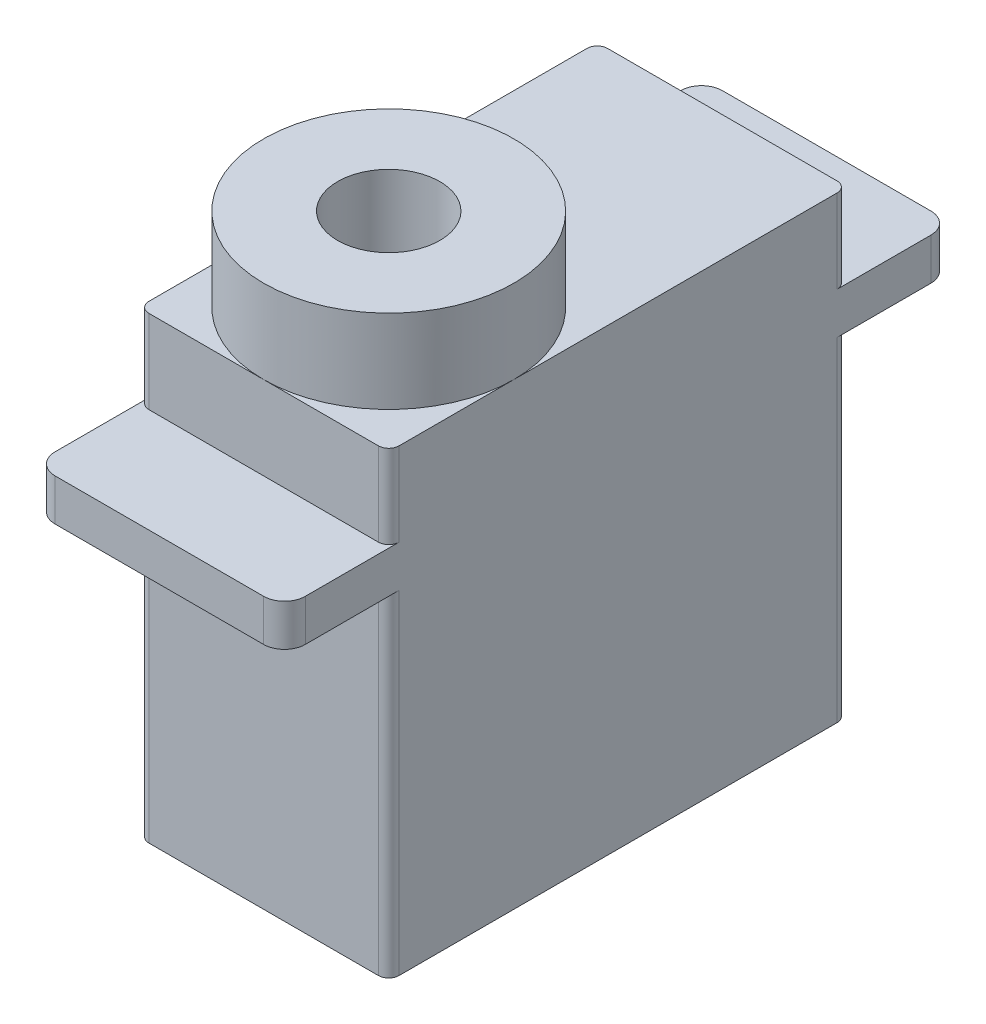
ISO-10303-21;
HEADER;
FILE_DESCRIPTION(('STEP AP214'),'2;1');
FILE_NAME('part.step','',(''),(''),'','','');
FILE_SCHEMA(('AUTOMOTIVE_DESIGN { 1 0 10303 214 1 1 1 1 }'));
ENDSEC;
DATA;
#1=APPLICATION_CONTEXT('core data for automotive mechanical design processes');
#2=APPLICATION_PROTOCOL_DEFINITION('international standard','automotive_design',2000,#1);
#3=PRODUCT_CONTEXT('',#1,'mechanical');
#4=PRODUCT('Part','Part','',(#3));
#5=PRODUCT_RELATED_PRODUCT_CATEGORY('part','',(#4));
#6=PRODUCT_DEFINITION_FORMATION('','',#4);
#7=PRODUCT_DEFINITION_CONTEXT('part definition',#1,'design');
#8=PRODUCT_DEFINITION('design','',#6,#7);
#9=PRODUCT_DEFINITION_SHAPE('','',#8);
#10=(LENGTH_UNIT() NAMED_UNIT(*) SI_UNIT(.MILLI.,.METRE.));
#11=(NAMED_UNIT(*) PLANE_ANGLE_UNIT() SI_UNIT($,.RADIAN.));
#12=(NAMED_UNIT(*) SI_UNIT($,.STERADIAN.) SOLID_ANGLE_UNIT());
#13=UNCERTAINTY_MEASURE_WITH_UNIT(LENGTH_MEASURE(1.E-05),#10,'distance_accuracy_value','');
#14=(GEOMETRIC_REPRESENTATION_CONTEXT(3) GLOBAL_UNCERTAINTY_ASSIGNED_CONTEXT((#13)) GLOBAL_UNIT_ASSIGNED_CONTEXT((#10,
#11,#12)) REPRESENTATION_CONTEXT('',''));
#15=CARTESIAN_POINT('',(0.,0.,0.));
#16=DIRECTION('',(0.,0.,1.));
#17=DIRECTION('',(1.,0.,0.));
#18=AXIS2_PLACEMENT_3D('',#15,#16,#17);
#19=CARTESIAN_POINT('',(0.,22.,31.7209302325581));
#20=DIRECTION('',(0.,0.,1.));
#21=DIRECTION('',(1.,0.,0.));
#22=AXIS2_PLACEMENT_3D('',#19,#20,#21);
#23=PLANE('',#22);
#24=DIRECTION('',(1.,0.,0.));
#25=VECTOR('',#24,1.);
#26=CARTESIAN_POINT('',(12.,18.,31.7209302325581));
#27=LINE('',#26,#25);
#28=CARTESIAN_POINT('',(0.5,18.,31.7209302325581));
#29=VERTEX_POINT('',#28);
#30=CARTESIAN_POINT('',(11.5,18.,31.7209302325581));
#31=VERTEX_POINT('',#30);
#32=EDGE_CURVE('E521',#29,#31,#27,.T.);
#33=ORIENTED_EDGE('',*,*,#32,.F.);
#34=DIRECTION('',(0.,-1.,0.));
#35=VECTOR('',#34,1.);
#36=CARTESIAN_POINT('',(0.5,22.,31.7209302325581));
#37=LINE('',#36,#35);
#38=CARTESIAN_POINT('',(0.5,22.,31.7209302325581));
#39=VERTEX_POINT('',#38);
#40=EDGE_CURVE('E327',#29,#39,#37,.F.);
#41=ORIENTED_EDGE('',*,*,#40,.T.);
#42=DIRECTION('',(-1.,0.,0.));
#43=VECTOR('',#42,1.);
#44=CARTESIAN_POINT('',(0.,22.,31.7209302325581));
#45=LINE('',#44,#43);
#46=CARTESIAN_POINT('',(11.5,22.,31.7209302325581));
#47=VERTEX_POINT('',#46);
#48=EDGE_CURVE('E240',#47,#39,#45,.T.);
#49=ORIENTED_EDGE('',*,*,#48,.F.);
#50=DIRECTION('',(0.,-1.,0.));
#51=VECTOR('',#50,1.);
#52=CARTESIAN_POINT('',(11.5,22.,31.7209302325581));
#53=LINE('',#52,#51);
#54=EDGE_CURVE('E324',#47,#31,#53,.T.);
#55=ORIENTED_EDGE('',*,*,#54,.T.);
#56=EDGE_LOOP('',(#33,#41,#49,#55));
#57=FACE_BOUND('',#56,.T.);
#58=ADVANCED_FACE('F33',(#57),#23,.F.);
#59=DIRECTION('',(-1.,0.,0.));
#60=VECTOR('',#59,1.);
#61=CARTESIAN_POINT('',(12.,16.,31.7209302325581));
#62=LINE('',#61,#60);
#63=CARTESIAN_POINT('',(11.5,16.,31.7209302325581));
#64=VERTEX_POINT('',#63);
#65=CARTESIAN_POINT('',(0.5,16.,31.7209302325581));
#66=VERTEX_POINT('',#65);
#67=EDGE_CURVE('E373',#64,#66,#62,.T.);
#68=ORIENTED_EDGE('',*,*,#67,.F.);
#69=DIRECTION('',(0.,-1.,0.));
#70=VECTOR('',#69,1.);
#71=CARTESIAN_POINT('',(11.5,22.,31.7209302325581));
#72=LINE('',#71,#70);
#73=CARTESIAN_POINT('',(11.5,0.,31.7209302325581));
#74=VERTEX_POINT('',#73);
#75=EDGE_CURVE('E335',#64,#74,#72,.T.);
#76=ORIENTED_EDGE('',*,*,#75,.T.);
#77=DIRECTION('',(-1.,0.,0.));
#78=VECTOR('',#77,1.);
#79=CARTESIAN_POINT('',(0.,0.,31.7209302325581));
#80=LINE('',#79,#78);
#81=CARTESIAN_POINT('',(0.5,0.,31.7209302325581));
#82=VERTEX_POINT('',#81);
#83=EDGE_CURVE('E258',#74,#82,#80,.T.);
#84=ORIENTED_EDGE('',*,*,#83,.T.);
#85=DIRECTION('',(0.,-1.,0.));
#86=VECTOR('',#85,1.);
#87=CARTESIAN_POINT('',(0.5,22.,31.7209302325581));
#88=LINE('',#87,#86);
#89=EDGE_CURVE('E333',#82,#66,#88,.F.);
#90=ORIENTED_EDGE('',*,*,#89,.T.);
#91=EDGE_LOOP('',(#68,#76,#84,#90));
#92=FACE_BOUND('',#91,.T.);
#93=ADVANCED_FACE('F434',(#92),#23,.F.);
#94=CARTESIAN_POINT('',(0.,22.,53.7209302325581));
#95=DIRECTION('',(0.,0.,-1.));
#96=DIRECTION('',(-1.,0.,0.));
#97=AXIS2_PLACEMENT_3D('',#94,#95,#96);
#98=PLANE('',#97);
#99=DIRECTION('',(1.,0.,0.));
#100=VECTOR('',#99,1.);
#101=CARTESIAN_POINT('',(0.,16.,53.7209302325581));
#102=LINE('',#101,#100);
#103=CARTESIAN_POINT('',(0.5,16.,53.7209302325581));
#104=VERTEX_POINT('',#103);
#105=CARTESIAN_POINT('',(11.5,16.,53.7209302325581));
#106=VERTEX_POINT('',#105);
#107=EDGE_CURVE('E389',#104,#106,#102,.T.);
#108=ORIENTED_EDGE('',*,*,#107,.F.);
#109=DIRECTION('',(0.,-1.,0.));
#110=VECTOR('',#109,1.);
#111=CARTESIAN_POINT('',(0.5,22.,53.7209302325581));
#112=LINE('',#111,#110);
#113=CARTESIAN_POINT('',(0.5,0.,53.7209302325581));
#114=VERTEX_POINT('',#113);
#115=EDGE_CURVE('E347',#104,#114,#112,.T.);
#116=ORIENTED_EDGE('',*,*,#115,.T.);
#117=DIRECTION('',(1.,0.,0.));
#118=VECTOR('',#117,1.);
#119=CARTESIAN_POINT('',(0.,0.,53.7209302325581));
#120=LINE('',#119,#118);
#121=CARTESIAN_POINT('',(11.5,0.,53.7209302325581));
#122=VERTEX_POINT('',#121);
#123=EDGE_CURVE('E253',#114,#122,#120,.T.);
#124=ORIENTED_EDGE('',*,*,#123,.T.);
#125=DIRECTION('',(0.,-1.,0.));
#126=VECTOR('',#125,1.);
#127=CARTESIAN_POINT('',(11.5,22.,53.7209302325581));
#128=LINE('',#127,#126);
#129=EDGE_CURVE('E48',#122,#106,#128,.F.);
#130=ORIENTED_EDGE('',*,*,#129,.T.);
#131=EDGE_LOOP('',(#108,#116,#124,#130));
#132=FACE_BOUND('',#131,.T.);
#133=ADVANCED_FACE('F388',(#132),#98,.F.);
#134=DIRECTION('',(-1.,0.,0.));
#135=VECTOR('',#134,1.);
#136=CARTESIAN_POINT('',(0.,18.,53.7209302325581));
#137=LINE('',#136,#135);
#138=CARTESIAN_POINT('',(11.5,18.,53.7209302325581));
#139=VERTEX_POINT('',#138);
#140=CARTESIAN_POINT('',(0.5,18.,53.7209302325581));
#141=VERTEX_POINT('',#140);
#142=EDGE_CURVE('E391',#139,#141,#137,.T.);
#143=ORIENTED_EDGE('',*,*,#142,.F.);
#144=DIRECTION('',(0.,-1.,0.));
#145=VECTOR('',#144,1.);
#146=CARTESIAN_POINT('',(11.5,22.,53.7209302325581));
#147=LINE('',#146,#145);
#148=CARTESIAN_POINT('',(11.5,22.,53.7209302325581));
#149=VERTEX_POINT('',#148);
#150=EDGE_CURVE('E223',#139,#149,#147,.F.);
#151=ORIENTED_EDGE('',*,*,#150,.T.);
#152=DIRECTION('',(1.,0.,0.));
#153=VECTOR('',#152,1.);
#154=CARTESIAN_POINT('',(0.,22.,53.7209302325581));
#155=LINE('',#154,#153);
#156=CARTESIAN_POINT('',(6.,22.,53.7209302325581));
#157=VERTEX_POINT('',#156);
#158=EDGE_CURVE('E216',#157,#149,#155,.T.);
#159=ORIENTED_EDGE('',*,*,#158,.F.);
#160=CARTESIAN_POINT('',(0.5,22.,53.7209302325581));
#161=VERTEX_POINT('',#160);
#162=EDGE_CURVE('E203',#161,#157,#155,.T.);
#163=ORIENTED_EDGE('',*,*,#162,.F.);
#164=DIRECTION('',(0.,-1.,0.));
#165=VECTOR('',#164,1.);
#166=CARTESIAN_POINT('',(0.5,22.,53.7209302325581));
#167=LINE('',#166,#165);
#168=EDGE_CURVE('E307',#161,#141,#167,.T.);
#169=ORIENTED_EDGE('',*,*,#168,.T.);
#170=EDGE_LOOP('',(#143,#151,#159,#163,#169));
#171=FACE_BOUND('',#170,.T.);
#172=ADVANCED_FACE('F221',(#171),#98,.F.);
#173=CARTESIAN_POINT('',(0.,22.,0.));
#174=DIRECTION('',(0.,1.,0.));
#175=DIRECTION('',(0.,0.,1.));
#176=AXIS2_PLACEMENT_3D('',#173,#174,#175);
#177=PLANE('',#176);
#178=ORIENTED_EDGE('',*,*,#158,.T.);
#179=CARTESIAN_POINT('',(11.5,22.,53.2209302325581));
#180=DIRECTION('',(0.,1.,0.));
#181=DIRECTION('',(0.,0.,1.));
#182=AXIS2_PLACEMENT_3D('',#179,#180,#181);
#183=CIRCLE('',#182,0.5);
#184=CARTESIAN_POINT('',(12.,22.,53.2209302325581));
#185=VERTEX_POINT('',#184);
#186=EDGE_CURVE('E310',#149,#185,#183,.T.);
#187=ORIENTED_EDGE('',*,*,#186,.T.);
#188=DIRECTION('',(0.,0.,-1.));
#189=VECTOR('',#188,1.);
#190=CARTESIAN_POINT('',(12.,22.,31.7209302325581));
#191=LINE('',#190,#189);
#192=CARTESIAN_POINT('',(12.,22.,47.7209302325581));
#193=VERTEX_POINT('',#192);
#194=EDGE_CURVE('E231',#185,#193,#191,.T.);
#195=ORIENTED_EDGE('',*,*,#194,.T.);
#196=CARTESIAN_POINT('',(6.,22.,47.7209302325581));
#197=DIRECTION('',(0.,1.,0.));
#198=DIRECTION('',(0.,0.,1.));
#199=AXIS2_PLACEMENT_3D('',#196,#197,#198);
#200=CIRCLE('',#199,6.);
#201=EDGE_CURVE('E228',#157,#193,#200,.T.);
#202=ORIENTED_EDGE('',*,*,#201,.F.);
#203=EDGE_LOOP('',(#178,#187,#195,#202));
#204=FACE_BOUND('',#203,.T.);
#205=ADVANCED_FACE('F229',(#204),#177,.T.);
#206=ORIENTED_EDGE('',*,*,#48,.T.);
#207=CARTESIAN_POINT('',(0.5,22.,32.2209302325581));
#208=DIRECTION('',(0.,1.,0.));
#209=DIRECTION('',(0.,0.,1.));
#210=AXIS2_PLACEMENT_3D('',#207,#208,#209);
#211=CIRCLE('',#210,0.5);
#212=CARTESIAN_POINT('',(0.,22.,32.2209302325581));
#213=VERTEX_POINT('',#212);
#214=EDGE_CURVE('E331',#39,#213,#211,.T.);
#215=ORIENTED_EDGE('',*,*,#214,.T.);
#216=DIRECTION('',(0.,0.,1.));
#217=VECTOR('',#216,1.);
#218=CARTESIAN_POINT('',(0.,22.,31.7209302325581));
#219=LINE('',#218,#217);
#220=CARTESIAN_POINT('',(0.,22.,47.7209302325581));
#221=VERTEX_POINT('',#220);
#222=EDGE_CURVE('E226',#213,#221,#219,.T.);
#223=ORIENTED_EDGE('',*,*,#222,.T.);
#224=EDGE_CURVE('E238',#193,#221,#200,.T.);
#225=ORIENTED_EDGE('',*,*,#224,.F.);
#226=CARTESIAN_POINT('',(12.,22.,32.2209302325581));
#227=VERTEX_POINT('',#226);
#228=EDGE_CURVE('E215',#193,#227,#191,.T.);
#229=ORIENTED_EDGE('',*,*,#228,.T.);
#230=CARTESIAN_POINT('',(11.5,22.,32.2209302325581));
#231=DIRECTION('',(0.,1.,0.));
#232=DIRECTION('',(0.,0.,1.));
#233=AXIS2_PLACEMENT_3D('',#230,#231,#232);
#234=CIRCLE('',#233,0.5);
#235=EDGE_CURVE('E329',#227,#47,#234,.T.);
#236=ORIENTED_EDGE('',*,*,#235,.T.);
#237=EDGE_LOOP('',(#206,#215,#223,#225,#229,#236));
#238=FACE_BOUND('',#237,.T.);
#239=ADVANCED_FACE('F427',(#238),#177,.T.);
#240=CARTESIAN_POINT('',(0.,22.,31.7209302325581));
#241=DIRECTION('',(1.,0.,0.));
#242=DIRECTION('',(0.,0.,-1.));
#243=AXIS2_PLACEMENT_3D('',#240,#241,#242);
#244=PLANE('',#243);
#245=DIRECTION('',(0.,0.,-1.));
#246=VECTOR('',#245,1.);
#247=CARTESIAN_POINT('',(0.,18.,58.7209302325581));
#248=LINE('',#247,#246);
#249=CARTESIAN_POINT('',(0.,18.,57.7209302325581));
#250=VERTEX_POINT('',#249);
#251=CARTESIAN_POINT('',(0.,18.,53.2209302325581));
#252=VERTEX_POINT('',#251);
#253=EDGE_CURVE('E402',#250,#252,#248,.T.);
#254=ORIENTED_EDGE('',*,*,#253,.T.);
#255=DIRECTION('',(0.,-1.,0.));
#256=VECTOR('',#255,1.);
#257=CARTESIAN_POINT('',(0.,22.,53.2209302325581));
#258=LINE('',#257,#256);
#259=CARTESIAN_POINT('',(0.,22.,53.2209302325581));
#260=VERTEX_POINT('',#259);
#261=EDGE_CURVE('E321',#252,#260,#258,.F.);
#262=ORIENTED_EDGE('',*,*,#261,.T.);
#263=EDGE_CURVE('E247',#221,#260,#219,.T.);
#264=ORIENTED_EDGE('',*,*,#263,.F.);
#265=ORIENTED_EDGE('',*,*,#222,.F.);
#266=DIRECTION('',(0.,-1.,0.));
#267=VECTOR('',#266,1.);
#268=CARTESIAN_POINT('',(0.,22.,32.2209302325581));
#269=LINE('',#268,#267);
#270=CARTESIAN_POINT('',(0.,18.,32.2209302325581));
#271=VERTEX_POINT('',#270);
#272=EDGE_CURVE('E318',#213,#271,#269,.T.);
#273=ORIENTED_EDGE('',*,*,#272,.T.);
#274=DIRECTION('',(0.,0.,1.));
#275=VECTOR('',#274,1.);
#276=CARTESIAN_POINT('',(0.,18.,26.7209302325581));
#277=LINE('',#276,#275);
#278=CARTESIAN_POINT('',(0.,18.,27.7209302325581));
#279=VERTEX_POINT('',#278);
#280=EDGE_CURVE('E516',#279,#271,#277,.T.);
#281=ORIENTED_EDGE('',*,*,#280,.F.);
#282=DIRECTION('',(0.,1.,0.));
#283=VECTOR('',#282,1.);
#284=CARTESIAN_POINT('',(0.,16.,27.7209302325581));
#285=LINE('',#284,#283);
#286=CARTESIAN_POINT('',(0.,16.,27.7209302325581));
#287=VERTEX_POINT('',#286);
#288=EDGE_CURVE('E272',#279,#287,#285,.F.);
#289=ORIENTED_EDGE('',*,*,#288,.T.);
#290=DIRECTION('',(0.,0.,1.));
#291=VECTOR('',#290,1.);
#292=CARTESIAN_POINT('',(0.,16.,26.7209302325581));
#293=LINE('',#292,#291);
#294=CARTESIAN_POINT('',(0.,16.,32.2209302325581));
#295=VERTEX_POINT('',#294);
#296=EDGE_CURVE('E370',#287,#295,#293,.T.);
#297=ORIENTED_EDGE('',*,*,#296,.T.);
#298=DIRECTION('',(0.,-1.,0.));
#299=VECTOR('',#298,1.);
#300=CARTESIAN_POINT('',(0.,22.,32.2209302325581));
#301=LINE('',#300,#299);
#302=CARTESIAN_POINT('',(0.,0.,32.2209302325581));
#303=VERTEX_POINT('',#302);
#304=EDGE_CURVE('E315',#295,#303,#301,.T.);
#305=ORIENTED_EDGE('',*,*,#304,.T.);
#306=DIRECTION('',(0.,0.,1.));
#307=VECTOR('',#306,1.);
#308=CARTESIAN_POINT('',(0.,0.,31.7209302325581));
#309=LINE('',#308,#307);
#310=CARTESIAN_POINT('',(0.,0.,53.2209302325581));
#311=VERTEX_POINT('',#310);
#312=EDGE_CURVE('E250',#303,#311,#309,.T.);
#313=ORIENTED_EDGE('',*,*,#312,.T.);
#314=DIRECTION('',(0.,-1.,0.));
#315=VECTOR('',#314,1.);
#316=CARTESIAN_POINT('',(0.,22.,53.2209302325581));
#317=LINE('',#316,#315);
#318=CARTESIAN_POINT('',(0.,16.,53.2209302325581));
#319=VERTEX_POINT('',#318);
#320=EDGE_CURVE('E312',#311,#319,#317,.F.);
#321=ORIENTED_EDGE('',*,*,#320,.T.);
#322=DIRECTION('',(0.,0.,-1.));
#323=VECTOR('',#322,1.);
#324=CARTESIAN_POINT('',(0.,16.,58.7209302325581));
#325=LINE('',#324,#323);
#326=CARTESIAN_POINT('',(0.,16.,57.7209302325581));
#327=VERTEX_POINT('',#326);
#328=EDGE_CURVE('E408',#327,#319,#325,.T.);
#329=ORIENTED_EDGE('',*,*,#328,.F.);
#330=DIRECTION('',(0.,-1.,0.));
#331=VECTOR('',#330,1.);
#332=CARTESIAN_POINT('',(0.,18.,57.7209302325581));
#333=LINE('',#332,#331);
#334=EDGE_CURVE('E270',#327,#250,#333,.F.);
#335=ORIENTED_EDGE('',*,*,#334,.T.);
#336=EDGE_LOOP('',(#254,#262,#264,#265,#273,#281,#289,#297,#305,#313,#321,#329,#335));
#337=FACE_BOUND('',#336,.T.);
#338=ADVANCED_FACE('F379',(#337),#244,.F.);
#339=CARTESIAN_POINT('',(12.,22.,31.7209302325581));
#340=DIRECTION('',(-1.,0.,0.));
#341=DIRECTION('',(0.,0.,1.));
#342=AXIS2_PLACEMENT_3D('',#339,#340,#341);
#343=PLANE('',#342);
#344=ORIENTED_EDGE('',*,*,#194,.F.);
#345=DIRECTION('',(0.,-1.,0.));
#346=VECTOR('',#345,1.);
#347=CARTESIAN_POINT('',(12.,22.,53.2209302325581));
#348=LINE('',#347,#346);
#349=CARTESIAN_POINT('',(12.,18.,53.2209302325581));
#350=VERTEX_POINT('',#349);
#351=EDGE_CURVE('E304',#185,#350,#348,.T.);
#352=ORIENTED_EDGE('',*,*,#351,.T.);
#353=DIRECTION('',(0.,0.,-1.));
#354=VECTOR('',#353,1.);
#355=CARTESIAN_POINT('',(12.,18.,58.7209302325581));
#356=LINE('',#355,#354);
#357=CARTESIAN_POINT('',(12.,18.,57.7209302325581));
#358=VERTEX_POINT('',#357);
#359=EDGE_CURVE('E404',#358,#350,#356,.T.);
#360=ORIENTED_EDGE('',*,*,#359,.F.);
#361=DIRECTION('',(0.,1.,0.));
#362=VECTOR('',#361,1.);
#363=CARTESIAN_POINT('',(12.,16.,57.7209302325581));
#364=LINE('',#363,#362);
#365=CARTESIAN_POINT('',(12.,16.,57.7209302325581));
#366=VERTEX_POINT('',#365);
#367=EDGE_CURVE('E278',#358,#366,#364,.F.);
#368=ORIENTED_EDGE('',*,*,#367,.T.);
#369=DIRECTION('',(0.,0.,-1.));
#370=VECTOR('',#369,1.);
#371=CARTESIAN_POINT('',(12.,16.,58.7209302325581));
#372=LINE('',#371,#370);
#373=CARTESIAN_POINT('',(12.,16.,53.2209302325581));
#374=VERTEX_POINT('',#373);
#375=EDGE_CURVE('E406',#366,#374,#372,.T.);
#376=ORIENTED_EDGE('',*,*,#375,.T.);
#377=DIRECTION('',(0.,-1.,0.));
#378=VECTOR('',#377,1.);
#379=CARTESIAN_POINT('',(12.,22.,53.2209302325581));
#380=LINE('',#379,#378);
#381=CARTESIAN_POINT('',(12.,0.,53.2209302325581));
#382=VERTEX_POINT('',#381);
#383=EDGE_CURVE('E296',#374,#382,#380,.T.);
#384=ORIENTED_EDGE('',*,*,#383,.T.);
#385=DIRECTION('',(0.,0.,-1.));
#386=VECTOR('',#385,1.);
#387=CARTESIAN_POINT('',(12.,0.,31.7209302325581));
#388=LINE('',#387,#386);
#389=CARTESIAN_POINT('',(12.,0.,32.2209302325581));
#390=VERTEX_POINT('',#389);
#391=EDGE_CURVE('E255',#382,#390,#388,.T.);
#392=ORIENTED_EDGE('',*,*,#391,.T.);
#393=DIRECTION('',(0.,-1.,0.));
#394=VECTOR('',#393,1.);
#395=CARTESIAN_POINT('',(12.,22.,32.2209302325581));
#396=LINE('',#395,#394);
#397=CARTESIAN_POINT('',(12.,16.,32.2209302325581));
#398=VERTEX_POINT('',#397);
#399=EDGE_CURVE('E299',#390,#398,#396,.F.);
#400=ORIENTED_EDGE('',*,*,#399,.T.);
#401=DIRECTION('',(0.,0.,1.));
#402=VECTOR('',#401,1.);
#403=CARTESIAN_POINT('',(12.,16.,26.7209302325581));
#404=LINE('',#403,#402);
#405=CARTESIAN_POINT('',(12.,16.,27.7209302325581));
#406=VERTEX_POINT('',#405);
#407=EDGE_CURVE('E392',#406,#398,#404,.T.);
#408=ORIENTED_EDGE('',*,*,#407,.F.);
#409=DIRECTION('',(0.,-1.,0.));
#410=VECTOR('',#409,1.);
#411=CARTESIAN_POINT('',(12.,18.,27.7209302325581));
#412=LINE('',#411,#410);
#413=CARTESIAN_POINT('',(12.,18.,27.7209302325581));
#414=VERTEX_POINT('',#413);
#415=EDGE_CURVE('E280',#406,#414,#412,.F.);
#416=ORIENTED_EDGE('',*,*,#415,.T.);
#417=DIRECTION('',(0.,0.,1.));
#418=VECTOR('',#417,1.);
#419=CARTESIAN_POINT('',(12.,18.,26.7209302325581));
#420=LINE('',#419,#418);
#421=CARTESIAN_POINT('',(12.,18.,32.2209302325581));
#422=VERTEX_POINT('',#421);
#423=EDGE_CURVE('E518',#414,#422,#420,.T.);
#424=ORIENTED_EDGE('',*,*,#423,.T.);
#425=DIRECTION('',(0.,-1.,0.));
#426=VECTOR('',#425,1.);
#427=CARTESIAN_POINT('',(12.,22.,32.2209302325581));
#428=LINE('',#427,#426);
#429=EDGE_CURVE('E302',#422,#227,#428,.F.);
#430=ORIENTED_EDGE('',*,*,#429,.T.);
#431=ORIENTED_EDGE('',*,*,#228,.F.);
#432=EDGE_LOOP('',(#344,#352,#360,#368,#376,#384,#392,#400,#408,#416,#424,#430,#431));
#433=FACE_BOUND('',#432,.T.);
#434=ADVANCED_FACE('F444',(#433),#343,.F.);
#435=ORIENTED_EDGE('',*,*,#263,.T.);
#436=CARTESIAN_POINT('',(0.5,22.,53.2209302325581));
#437=DIRECTION('',(0.,1.,0.));
#438=DIRECTION('',(0.,0.,1.));
#439=AXIS2_PLACEMENT_3D('',#436,#437,#438);
#440=CIRCLE('',#439,0.5);
#441=EDGE_CURVE('E211',#260,#161,#440,.T.);
#442=ORIENTED_EDGE('',*,*,#441,.T.);
#443=ORIENTED_EDGE('',*,*,#162,.T.);
#444=EDGE_CURVE('E208',#221,#157,#200,.T.);
#445=ORIENTED_EDGE('',*,*,#444,.F.);
#446=EDGE_LOOP('',(#435,#442,#443,#445));
#447=FACE_BOUND('',#446,.T.);
#448=ADVANCED_FACE('F206',(#447),#177,.T.);
#449=CARTESIAN_POINT('',(0.,0.,0.));
#450=DIRECTION('',(0.,1.,0.));
#451=DIRECTION('',(0.,0.,1.));
#452=AXIS2_PLACEMENT_3D('',#449,#450,#451);
#453=PLANE('',#452);
#454=ORIENTED_EDGE('',*,*,#83,.F.);
#455=CARTESIAN_POINT('',(11.5,0.,32.2209302325581));
#456=DIRECTION('',(0.,1.,0.));
#457=DIRECTION('',(0.,0.,1.));
#458=AXIS2_PLACEMENT_3D('',#455,#456,#457);
#459=CIRCLE('',#458,0.5);
#460=EDGE_CURVE('E344',#74,#390,#459,.F.);
#461=ORIENTED_EDGE('',*,*,#460,.T.);
#462=ORIENTED_EDGE('',*,*,#391,.F.);
#463=CARTESIAN_POINT('',(11.5,0.,53.2209302325581));
#464=DIRECTION('',(0.,1.,0.));
#465=DIRECTION('',(0.,0.,1.));
#466=AXIS2_PLACEMENT_3D('',#463,#464,#465);
#467=CIRCLE('',#466,0.5);
#468=EDGE_CURVE('E338',#382,#122,#467,.F.);
#469=ORIENTED_EDGE('',*,*,#468,.T.);
#470=ORIENTED_EDGE('',*,*,#123,.F.);
#471=CARTESIAN_POINT('',(0.5,0.,53.2209302325581));
#472=DIRECTION('',(0.,1.,0.));
#473=DIRECTION('',(0.,0.,1.));
#474=AXIS2_PLACEMENT_3D('',#471,#472,#473);
#475=CIRCLE('',#474,0.5);
#476=EDGE_CURVE('E340',#114,#311,#475,.F.);
#477=ORIENTED_EDGE('',*,*,#476,.T.);
#478=ORIENTED_EDGE('',*,*,#312,.F.);
#479=CARTESIAN_POINT('',(0.5,0.,32.2209302325581));
#480=DIRECTION('',(0.,1.,0.));
#481=DIRECTION('',(0.,0.,1.));
#482=AXIS2_PLACEMENT_3D('',#479,#480,#481);
#483=CIRCLE('',#482,0.5);
#484=EDGE_CURVE('E342',#303,#82,#483,.F.);
#485=ORIENTED_EDGE('',*,*,#484,.T.);
#486=EDGE_LOOP('',(#454,#461,#462,#469,#470,#477,#478,#485));
#487=FACE_BOUND('',#486,.T.);
#488=ADVANCED_FACE('F383',(#487),#453,.F.);
#489=CARTESIAN_POINT('',(6.,26.,47.7209302325581));
#490=DIRECTION('',(0.,1.,0.));
#491=DIRECTION('',(0.,0.,1.));
#492=AXIS2_PLACEMENT_3D('',#489,#490,#491);
#493=PLANE('',#492);
#494=CARTESIAN_POINT('',(6.,26.,47.7209302325581));
#495=DIRECTION('',(0.,1.,0.));
#496=DIRECTION('',(0.,0.,1.));
#497=AXIS2_PLACEMENT_3D('',#494,#495,#496);
#498=CIRCLE('',#497,6.);
#499=CARTESIAN_POINT('',(6.,26.,53.7209302325581));
#500=VERTEX_POINT('',#499);
#501=EDGE_CURVE('E235',#500,#500,#498,.T.);
#502=ORIENTED_EDGE('',*,*,#501,.T.);
#503=EDGE_LOOP('',(#502));
#504=FACE_BOUND('',#503,.T.);
#505=CARTESIAN_POINT('',(6.,26.,47.7209302325581));
#506=DIRECTION('',(0.,1.,0.));
#507=DIRECTION('',(0.,0.,1.));
#508=AXIS2_PLACEMENT_3D('',#505,#506,#507);
#509=CIRCLE('',#508,2.45);
#510=CARTESIAN_POINT('',(6.,26.,50.1709302325581));
#511=VERTEX_POINT('',#510);
#512=EDGE_CURVE('E236',#511,#511,#509,.T.);
#513=ORIENTED_EDGE('',*,*,#512,.F.);
#514=EDGE_LOOP('',(#513));
#515=FACE_BOUND('',#514,.T.);
#516=ADVANCED_FACE('F428',(#504,#515),#493,.T.);
#517=CARTESIAN_POINT('',(6.,26.,47.7209302325581));
#518=DIRECTION('',(0.,-1.,0.));
#519=DIRECTION('',(0.,0.,-1.));
#520=AXIS2_PLACEMENT_3D('',#517,#518,#519);
#521=CYLINDRICAL_SURFACE('',#520,6.);
#522=ORIENTED_EDGE('',*,*,#501,.F.);
#523=EDGE_LOOP('',(#522));
#524=FACE_BOUND('',#523,.T.);
#525=ORIENTED_EDGE('',*,*,#201,.T.);
#526=ORIENTED_EDGE('',*,*,#224,.T.);
#527=ORIENTED_EDGE('',*,*,#444,.T.);
#528=EDGE_LOOP('',(#525,#526,#527));
#529=FACE_BOUND('',#528,.T.);
#530=ADVANCED_FACE('F239',(#524,#529),#521,.T.);
#531=CARTESIAN_POINT('',(6.,26.,47.7209302325581));
#532=DIRECTION('',(0.,-1.,0.));
#533=DIRECTION('',(0.,0.,-1.));
#534=AXIS2_PLACEMENT_3D('',#531,#532,#533);
#535=CYLINDRICAL_SURFACE('',#534,2.45);
#536=ORIENTED_EDGE('',*,*,#512,.T.);
#537=EDGE_LOOP('',(#536));
#538=FACE_BOUND('',#537,.T.);
#539=CARTESIAN_POINT('',(6.,22.,47.7209302325581));
#540=DIRECTION('',(0.,1.,0.));
#541=DIRECTION('',(0.,0.,1.));
#542=AXIS2_PLACEMENT_3D('',#539,#540,#541);
#543=CIRCLE('',#542,2.45);
#544=CARTESIAN_POINT('',(6.,22.,50.1709302325581));
#545=VERTEX_POINT('',#544);
#546=EDGE_CURVE('E410',#545,#545,#543,.T.);
#547=ORIENTED_EDGE('',*,*,#546,.F.);
#548=EDGE_LOOP('',(#547));
#549=FACE_BOUND('',#548,.T.);
#550=ADVANCED_FACE('F417',(#538,#549),#535,.F.);
#551=ORIENTED_EDGE('',*,*,#546,.T.);
#552=EDGE_LOOP('',(#551));
#553=FACE_BOUND('',#552,.T.);
#554=ADVANCED_FACE('F415',(#553),#177,.T.);
#555=CARTESIAN_POINT('',(0.,16.,58.7209302325581));
#556=DIRECTION('',(0.,1.,0.));
#557=DIRECTION('',(0.,0.,1.));
#558=AXIS2_PLACEMENT_3D('',#555,#556,#557);
#559=PLANE('',#558);
#560=DIRECTION('',(1.,0.,0.));
#561=VECTOR('',#560,1.);
#562=CARTESIAN_POINT('',(0.,16.,58.7209302325581));
#563=LINE('',#562,#561);
#564=CARTESIAN_POINT('',(1.,16.,58.7209302325581));
#565=VERTEX_POINT('',#564);
#566=CARTESIAN_POINT('',(11.,16.,58.7209302325581));
#567=VERTEX_POINT('',#566);
#568=EDGE_CURVE('E395',#565,#567,#563,.T.);
#569=ORIENTED_EDGE('',*,*,#568,.F.);
#570=CARTESIAN_POINT('',(1.,16.,57.7209302325581));
#571=DIRECTION('',(0.,1.,0.));
#572=DIRECTION('',(0.,0.,1.));
#573=AXIS2_PLACEMENT_3D('',#570,#571,#572);
#574=CIRCLE('',#573,1.);
#575=EDGE_CURVE('E290',#565,#327,#574,.F.);
#576=ORIENTED_EDGE('',*,*,#575,.T.);
#577=ORIENTED_EDGE('',*,*,#328,.T.);
#578=CARTESIAN_POINT('',(0.5,16.,53.2209302325581));
#579=DIRECTION('',(0.,1.,0.));
#580=DIRECTION('',(0.,0.,1.));
#581=AXIS2_PLACEMENT_3D('',#578,#579,#580);
#582=CIRCLE('',#581,0.5);
#583=EDGE_CURVE('E41',#319,#104,#582,.T.);
#584=ORIENTED_EDGE('',*,*,#583,.T.);
#585=ORIENTED_EDGE('',*,*,#107,.T.);
#586=CARTESIAN_POINT('',(11.5,16.,53.2209302325581));
#587=DIRECTION('',(0.,1.,0.));
#588=DIRECTION('',(0.,0.,1.));
#589=AXIS2_PLACEMENT_3D('',#586,#587,#588);
#590=CIRCLE('',#589,0.5);
#591=EDGE_CURVE('E11',#106,#374,#590,.T.);
#592=ORIENTED_EDGE('',*,*,#591,.T.);
#593=ORIENTED_EDGE('',*,*,#375,.F.);
#594=CARTESIAN_POINT('',(11.,16.,57.7209302325581));
#595=DIRECTION('',(0.,1.,0.));
#596=DIRECTION('',(0.,0.,1.));
#597=AXIS2_PLACEMENT_3D('',#594,#595,#596);
#598=CIRCLE('',#597,1.);
#599=EDGE_CURVE('E288',#366,#567,#598,.F.);
#600=ORIENTED_EDGE('',*,*,#599,.T.);
#601=EDGE_LOOP('',(#569,#576,#577,#584,#585,#592,#593,#600));
#602=FACE_BOUND('',#601,.T.);
#603=ADVANCED_FACE('F425',(#602),#559,.F.);
#604=CARTESIAN_POINT('',(0.,18.,58.7209302325581));
#605=DIRECTION('',(0.,-1.,0.));
#606=DIRECTION('',(0.,0.,-1.));
#607=AXIS2_PLACEMENT_3D('',#604,#605,#606);
#608=PLANE('',#607);
#609=ORIENTED_EDGE('',*,*,#253,.F.);
#610=CARTESIAN_POINT('',(1.,18.,57.7209302325581));
#611=DIRECTION('',(0.,-1.,0.));
#612=DIRECTION('',(0.,0.,-1.));
#613=AXIS2_PLACEMENT_3D('',#610,#611,#612);
#614=CIRCLE('',#613,1.);
#615=CARTESIAN_POINT('',(1.,18.,58.7209302325581));
#616=VERTEX_POINT('',#615);
#617=EDGE_CURVE('E294',#250,#616,#614,.F.);
#618=ORIENTED_EDGE('',*,*,#617,.T.);
#619=DIRECTION('',(-1.,0.,0.));
#620=VECTOR('',#619,1.);
#621=CARTESIAN_POINT('',(0.,18.,58.7209302325581));
#622=LINE('',#621,#620);
#623=CARTESIAN_POINT('',(11.,18.,58.7209302325581));
#624=VERTEX_POINT('',#623);
#625=EDGE_CURVE('E399',#624,#616,#622,.T.);
#626=ORIENTED_EDGE('',*,*,#625,.F.);
#627=CARTESIAN_POINT('',(11.,18.,57.7209302325581));
#628=DIRECTION('',(0.,-1.,0.));
#629=DIRECTION('',(0.,0.,-1.));
#630=AXIS2_PLACEMENT_3D('',#627,#628,#629);
#631=CIRCLE('',#630,1.);
#632=EDGE_CURVE('E292',#624,#358,#631,.F.);
#633=ORIENTED_EDGE('',*,*,#632,.T.);
#634=ORIENTED_EDGE('',*,*,#359,.T.);
#635=CARTESIAN_POINT('',(11.5,18.,53.2209302325581));
#636=DIRECTION('',(0.,-1.,0.));
#637=DIRECTION('',(0.,0.,-1.));
#638=AXIS2_PLACEMENT_3D('',#635,#636,#637);
#639=CIRCLE('',#638,0.5);
#640=EDGE_CURVE('E350',#350,#139,#639,.T.);
#641=ORIENTED_EDGE('',*,*,#640,.T.);
#642=ORIENTED_EDGE('',*,*,#142,.T.);
#643=CARTESIAN_POINT('',(0.5,18.,53.2209302325581));
#644=DIRECTION('',(0.,-1.,0.));
#645=DIRECTION('',(0.,0.,-1.));
#646=AXIS2_PLACEMENT_3D('',#643,#644,#645);
#647=CIRCLE('',#646,0.5);
#648=EDGE_CURVE('E352',#141,#252,#647,.T.);
#649=ORIENTED_EDGE('',*,*,#648,.T.);
#650=EDGE_LOOP('',(#609,#618,#626,#633,#634,#641,#642,#649));
#651=FACE_BOUND('',#650,.T.);
#652=ADVANCED_FACE('F511',(#651),#608,.F.);
#653=CARTESIAN_POINT('',(0.,0.,58.7209302325581));
#654=DIRECTION('',(0.,0.,1.));
#655=DIRECTION('',(1.,0.,0.));
#656=AXIS2_PLACEMENT_3D('',#653,#654,#655);
#657=PLANE('',#656);
#658=ORIENTED_EDGE('',*,*,#625,.T.);
#659=DIRECTION('',(0.,-1.,0.));
#660=VECTOR('',#659,1.);
#661=CARTESIAN_POINT('',(1.,16.,58.7209302325581));
#662=LINE('',#661,#660);
#663=EDGE_CURVE('E285',#616,#565,#662,.T.);
#664=ORIENTED_EDGE('',*,*,#663,.T.);
#665=ORIENTED_EDGE('',*,*,#568,.T.);
#666=DIRECTION('',(0.,1.,0.));
#667=VECTOR('',#666,1.);
#668=CARTESIAN_POINT('',(11.,18.,58.7209302325581));
#669=LINE('',#668,#667);
#670=EDGE_CURVE('E282',#567,#624,#669,.T.);
#671=ORIENTED_EDGE('',*,*,#670,.T.);
#672=EDGE_LOOP('',(#658,#664,#665,#671));
#673=FACE_BOUND('',#672,.T.);
#674=ADVANCED_FACE('F507',(#673),#657,.T.);
#675=CARTESIAN_POINT('',(12.,16.,26.7209302325581));
#676=DIRECTION('',(0.,1.,0.));
#677=DIRECTION('',(0.,0.,1.));
#678=AXIS2_PLACEMENT_3D('',#675,#676,#677);
#679=PLANE('',#678);
#680=ORIENTED_EDGE('',*,*,#296,.F.);
#681=CARTESIAN_POINT('',(1.,16.,27.7209302325581));
#682=DIRECTION('',(0.,1.,0.));
#683=DIRECTION('',(0.,0.,1.));
#684=AXIS2_PLACEMENT_3D('',#681,#682,#683);
#685=CIRCLE('',#684,1.);
#686=CARTESIAN_POINT('',(1.,16.,26.7209302325581));
#687=VERTEX_POINT('',#686);
#688=EDGE_CURVE('E276',#287,#687,#685,.F.);
#689=ORIENTED_EDGE('',*,*,#688,.T.);
#690=DIRECTION('',(-1.,0.,0.));
#691=VECTOR('',#690,1.);
#692=CARTESIAN_POINT('',(12.,16.,26.7209302325581));
#693=LINE('',#692,#691);
#694=CARTESIAN_POINT('',(11.,16.,26.7209302325581));
#695=VERTEX_POINT('',#694);
#696=EDGE_CURVE('E524',#695,#687,#693,.T.);
#697=ORIENTED_EDGE('',*,*,#696,.F.);
#698=CARTESIAN_POINT('',(11.,16.,27.7209302325581));
#699=DIRECTION('',(0.,1.,0.));
#700=DIRECTION('',(0.,0.,1.));
#701=AXIS2_PLACEMENT_3D('',#698,#699,#700);
#702=CIRCLE('',#701,1.);
#703=EDGE_CURVE('E274',#695,#406,#702,.F.);
#704=ORIENTED_EDGE('',*,*,#703,.T.);
#705=ORIENTED_EDGE('',*,*,#407,.T.);
#706=CARTESIAN_POINT('',(11.5,16.,32.2209302325581));
#707=DIRECTION('',(0.,1.,0.));
#708=DIRECTION('',(0.,0.,1.));
#709=AXIS2_PLACEMENT_3D('',#706,#707,#708);
#710=CIRCLE('',#709,0.5);
#711=EDGE_CURVE('E360',#398,#64,#710,.T.);
#712=ORIENTED_EDGE('',*,*,#711,.T.);
#713=ORIENTED_EDGE('',*,*,#67,.T.);
#714=CARTESIAN_POINT('',(0.5,16.,32.2209302325581));
#715=DIRECTION('',(0.,1.,0.));
#716=DIRECTION('',(0.,0.,1.));
#717=AXIS2_PLACEMENT_3D('',#714,#715,#716);
#718=CIRCLE('',#717,0.5);
#719=EDGE_CURVE('E362',#66,#295,#718,.T.);
#720=ORIENTED_EDGE('',*,*,#719,.T.);
#721=EDGE_LOOP('',(#680,#689,#697,#704,#705,#712,#713,#720));
#722=FACE_BOUND('',#721,.T.);
#723=ADVANCED_FACE('F369',(#722),#679,.F.);
#724=CARTESIAN_POINT('',(12.,18.,26.7209302325581));
#725=DIRECTION('',(0.,-1.,0.));
#726=DIRECTION('',(0.,0.,-1.));
#727=AXIS2_PLACEMENT_3D('',#724,#725,#726);
#728=PLANE('',#727);
#729=DIRECTION('',(1.,0.,0.));
#730=VECTOR('',#729,1.);
#731=CARTESIAN_POINT('',(12.,18.,26.7209302325581));
#732=LINE('',#731,#730);
#733=CARTESIAN_POINT('',(1.,18.,26.7209302325581));
#734=VERTEX_POINT('',#733);
#735=CARTESIAN_POINT('',(11.,18.,26.7209302325581));
#736=VERTEX_POINT('',#735);
#737=EDGE_CURVE('E520',#734,#736,#732,.T.);
#738=ORIENTED_EDGE('',*,*,#737,.F.);
#739=CARTESIAN_POINT('',(1.,18.,27.7209302325581));
#740=DIRECTION('',(0.,-1.,0.));
#741=DIRECTION('',(0.,0.,-1.));
#742=AXIS2_PLACEMENT_3D('',#739,#740,#741);
#743=CIRCLE('',#742,1.);
#744=EDGE_CURVE('E268',#734,#279,#743,.F.);
#745=ORIENTED_EDGE('',*,*,#744,.T.);
#746=ORIENTED_EDGE('',*,*,#280,.T.);
#747=CARTESIAN_POINT('',(0.5,18.,32.2209302325581));
#748=DIRECTION('',(0.,-1.,0.));
#749=DIRECTION('',(0.,0.,-1.));
#750=AXIS2_PLACEMENT_3D('',#747,#748,#749);
#751=CIRCLE('',#750,0.5);
#752=EDGE_CURVE('E355',#271,#29,#751,.T.);
#753=ORIENTED_EDGE('',*,*,#752,.T.);
#754=ORIENTED_EDGE('',*,*,#32,.T.);
#755=CARTESIAN_POINT('',(11.5,18.,32.2209302325581));
#756=DIRECTION('',(0.,-1.,0.));
#757=DIRECTION('',(0.,0.,-1.));
#758=AXIS2_PLACEMENT_3D('',#755,#756,#757);
#759=CIRCLE('',#758,0.5);
#760=EDGE_CURVE('E357',#31,#422,#759,.T.);
#761=ORIENTED_EDGE('',*,*,#760,.T.);
#762=ORIENTED_EDGE('',*,*,#423,.F.);
#763=CARTESIAN_POINT('',(11.,18.,27.7209302325581));
#764=DIRECTION('',(0.,-1.,0.));
#765=DIRECTION('',(0.,0.,-1.));
#766=AXIS2_PLACEMENT_3D('',#763,#764,#765);
#767=CIRCLE('',#766,1.);
#768=EDGE_CURVE('E266',#414,#736,#767,.F.);
#769=ORIENTED_EDGE('',*,*,#768,.T.);
#770=EDGE_LOOP('',(#738,#745,#746,#753,#754,#761,#762,#769));
#771=FACE_BOUND('',#770,.T.);
#772=ADVANCED_FACE('F537',(#771),#728,.F.);
#773=CARTESIAN_POINT('',(0.,0.,26.7209302325581));
#774=DIRECTION('',(0.,0.,-1.));
#775=DIRECTION('',(-1.,0.,0.));
#776=AXIS2_PLACEMENT_3D('',#773,#774,#775);
#777=PLANE('',#776);
#778=ORIENTED_EDGE('',*,*,#696,.T.);
#779=DIRECTION('',(0.,1.,0.));
#780=VECTOR('',#779,1.);
#781=CARTESIAN_POINT('',(1.,18.,26.7209302325581));
#782=LINE('',#781,#780);
#783=EDGE_CURVE('E263',#687,#734,#782,.T.);
#784=ORIENTED_EDGE('',*,*,#783,.T.);
#785=ORIENTED_EDGE('',*,*,#737,.T.);
#786=DIRECTION('',(0.,-1.,0.));
#787=VECTOR('',#786,1.);
#788=CARTESIAN_POINT('',(11.,16.,26.7209302325581));
#789=LINE('',#788,#787);
#790=EDGE_CURVE('E241',#736,#695,#789,.T.);
#791=ORIENTED_EDGE('',*,*,#790,.T.);
#792=EDGE_LOOP('',(#778,#784,#785,#791));
#793=FACE_BOUND('',#792,.T.);
#794=ADVANCED_FACE('F456',(#793),#777,.T.);
#795=CARTESIAN_POINT('',(1.,0.,27.7209302325581));
#796=DIRECTION('',(0.,-1.,0.));
#797=DIRECTION('',(0.,0.,-1.));
#798=AXIS2_PLACEMENT_3D('',#795,#796,#797);
#799=CYLINDRICAL_SURFACE('',#798,1.);
#800=ORIENTED_EDGE('',*,*,#688,.F.);
#801=ORIENTED_EDGE('',*,*,#288,.F.);
#802=ORIENTED_EDGE('',*,*,#744,.F.);
#803=ORIENTED_EDGE('',*,*,#783,.F.);
#804=EDGE_LOOP('',(#800,#801,#802,#803));
#805=FACE_BOUND('',#804,.T.);
#806=ADVANCED_FACE('F452',(#805),#799,.T.);
#807=CARTESIAN_POINT('',(11.,0.,27.7209302325581));
#808=DIRECTION('',(0.,1.,0.));
#809=DIRECTION('',(0.,0.,1.));
#810=AXIS2_PLACEMENT_3D('',#807,#808,#809);
#811=CYLINDRICAL_SURFACE('',#810,1.);
#812=ORIENTED_EDGE('',*,*,#768,.F.);
#813=ORIENTED_EDGE('',*,*,#415,.F.);
#814=ORIENTED_EDGE('',*,*,#703,.F.);
#815=ORIENTED_EDGE('',*,*,#790,.F.);
#816=EDGE_LOOP('',(#812,#813,#814,#815));
#817=FACE_BOUND('',#816,.T.);
#818=ADVANCED_FACE('F455',(#817),#811,.T.);
#819=CARTESIAN_POINT('',(1.,0.,57.7209302325581));
#820=DIRECTION('',(0.,1.,0.));
#821=DIRECTION('',(0.,0.,1.));
#822=AXIS2_PLACEMENT_3D('',#819,#820,#821);
#823=CYLINDRICAL_SURFACE('',#822,1.);
#824=ORIENTED_EDGE('',*,*,#617,.F.);
#825=ORIENTED_EDGE('',*,*,#334,.F.);
#826=ORIENTED_EDGE('',*,*,#575,.F.);
#827=ORIENTED_EDGE('',*,*,#663,.F.);
#828=EDGE_LOOP('',(#824,#825,#826,#827));
#829=FACE_BOUND('',#828,.T.);
#830=ADVANCED_FACE('F460',(#829),#823,.T.);
#831=CARTESIAN_POINT('',(11.,0.,57.7209302325581));
#832=DIRECTION('',(0.,-1.,0.));
#833=DIRECTION('',(0.,0.,-1.));
#834=AXIS2_PLACEMENT_3D('',#831,#832,#833);
#835=CYLINDRICAL_SURFACE('',#834,1.);
#836=ORIENTED_EDGE('',*,*,#599,.F.);
#837=ORIENTED_EDGE('',*,*,#367,.F.);
#838=ORIENTED_EDGE('',*,*,#632,.F.);
#839=ORIENTED_EDGE('',*,*,#670,.F.);
#840=EDGE_LOOP('',(#836,#837,#838,#839));
#841=FACE_BOUND('',#840,.T.);
#842=ADVANCED_FACE('F464',(#841),#835,.T.);
#843=CARTESIAN_POINT('',(11.5,22.,53.2209302325581));
#844=DIRECTION('',(0.,-1.,0.));
#845=DIRECTION('',(0.,0.,-1.));
#846=AXIS2_PLACEMENT_3D('',#843,#844,#845);
#847=CYLINDRICAL_SURFACE('',#846,0.5);
#848=ORIENTED_EDGE('',*,*,#186,.F.);
#849=ORIENTED_EDGE('',*,*,#150,.F.);
#850=ORIENTED_EDGE('',*,*,#640,.F.);
#851=ORIENTED_EDGE('',*,*,#351,.F.);
#852=EDGE_LOOP('',(#848,#849,#850,#851));
#853=FACE_BOUND('',#852,.T.);
#854=ADVANCED_FACE('F468',(#853),#847,.T.);
#855=CARTESIAN_POINT('',(0.5,22.,53.2209302325581));
#856=DIRECTION('',(0.,-1.,0.));
#857=DIRECTION('',(0.,0.,-1.));
#858=AXIS2_PLACEMENT_3D('',#855,#856,#857);
#859=CYLINDRICAL_SURFACE('',#858,0.5);
#860=ORIENTED_EDGE('',*,*,#441,.F.);
#861=ORIENTED_EDGE('',*,*,#261,.F.);
#862=ORIENTED_EDGE('',*,*,#648,.F.);
#863=ORIENTED_EDGE('',*,*,#168,.F.);
#864=EDGE_LOOP('',(#860,#861,#862,#863));
#865=FACE_BOUND('',#864,.T.);
#866=ADVANCED_FACE('F472',(#865),#859,.T.);
#867=CARTESIAN_POINT('',(0.5,22.,32.2209302325581));
#868=DIRECTION('',(0.,-1.,0.));
#869=DIRECTION('',(0.,0.,-1.));
#870=AXIS2_PLACEMENT_3D('',#867,#868,#869);
#871=CYLINDRICAL_SURFACE('',#870,0.5);
#872=ORIENTED_EDGE('',*,*,#214,.F.);
#873=ORIENTED_EDGE('',*,*,#40,.F.);
#874=ORIENTED_EDGE('',*,*,#752,.F.);
#875=ORIENTED_EDGE('',*,*,#272,.F.);
#876=EDGE_LOOP('',(#872,#873,#874,#875));
#877=FACE_BOUND('',#876,.T.);
#878=ADVANCED_FACE('F476',(#877),#871,.T.);
#879=CARTESIAN_POINT('',(11.5,22.,32.2209302325581));
#880=DIRECTION('',(0.,-1.,0.));
#881=DIRECTION('',(0.,0.,-1.));
#882=AXIS2_PLACEMENT_3D('',#879,#880,#881);
#883=CYLINDRICAL_SURFACE('',#882,0.5);
#884=ORIENTED_EDGE('',*,*,#235,.F.);
#885=ORIENTED_EDGE('',*,*,#429,.F.);
#886=ORIENTED_EDGE('',*,*,#760,.F.);
#887=ORIENTED_EDGE('',*,*,#54,.F.);
#888=EDGE_LOOP('',(#884,#885,#886,#887));
#889=FACE_BOUND('',#888,.T.);
#890=ADVANCED_FACE('F480',(#889),#883,.T.);
#891=CARTESIAN_POINT('',(11.5,22.,32.2209302325581));
#892=DIRECTION('',(0.,-1.,0.));
#893=DIRECTION('',(0.,0.,-1.));
#894=AXIS2_PLACEMENT_3D('',#891,#892,#893);
#895=CYLINDRICAL_SURFACE('',#894,0.5);
#896=ORIENTED_EDGE('',*,*,#711,.F.);
#897=ORIENTED_EDGE('',*,*,#399,.F.);
#898=ORIENTED_EDGE('',*,*,#460,.F.);
#899=ORIENTED_EDGE('',*,*,#75,.F.);
#900=EDGE_LOOP('',(#896,#897,#898,#899));
#901=FACE_BOUND('',#900,.T.);
#902=ADVANCED_FACE('F484',(#901),#895,.T.);
#903=CARTESIAN_POINT('',(0.5,22.,32.2209302325581));
#904=DIRECTION('',(0.,-1.,0.));
#905=DIRECTION('',(0.,0.,-1.));
#906=AXIS2_PLACEMENT_3D('',#903,#904,#905);
#907=CYLINDRICAL_SURFACE('',#906,0.5);
#908=ORIENTED_EDGE('',*,*,#719,.F.);
#909=ORIENTED_EDGE('',*,*,#89,.F.);
#910=ORIENTED_EDGE('',*,*,#484,.F.);
#911=ORIENTED_EDGE('',*,*,#304,.F.);
#912=EDGE_LOOP('',(#908,#909,#910,#911));
#913=FACE_BOUND('',#912,.T.);
#914=ADVANCED_FACE('F376',(#913),#907,.T.);
#915=CARTESIAN_POINT('',(0.5,22.,53.2209302325581));
#916=DIRECTION('',(0.,-1.,0.));
#917=DIRECTION('',(0.,0.,-1.));
#918=AXIS2_PLACEMENT_3D('',#915,#916,#917);
#919=CYLINDRICAL_SURFACE('',#918,0.5);
#920=ORIENTED_EDGE('',*,*,#583,.F.);
#921=ORIENTED_EDGE('',*,*,#320,.F.);
#922=ORIENTED_EDGE('',*,*,#476,.F.);
#923=ORIENTED_EDGE('',*,*,#115,.F.);
#924=EDGE_LOOP('',(#920,#921,#922,#923));
#925=FACE_BOUND('',#924,.T.);
#926=ADVANCED_FACE('F387',(#925),#919,.T.);
#927=CARTESIAN_POINT('',(11.5,22.,53.2209302325581));
#928=DIRECTION('',(0.,-1.,0.));
#929=DIRECTION('',(0.,0.,-1.));
#930=AXIS2_PLACEMENT_3D('',#927,#928,#929);
#931=CYLINDRICAL_SURFACE('',#930,0.5);
#932=ORIENTED_EDGE('',*,*,#591,.F.);
#933=ORIENTED_EDGE('',*,*,#129,.F.);
#934=ORIENTED_EDGE('',*,*,#468,.F.);
#935=ORIENTED_EDGE('',*,*,#383,.F.);
#936=EDGE_LOOP('',(#932,#933,#934,#935));
#937=FACE_BOUND('',#936,.T.);
#938=ADVANCED_FACE('F35',(#937),#931,.T.);
#939=CLOSED_SHELL('',(#58,#93,#133,#172,#205,#239,#338,#434,#448,#488,#516,#530,#550,#554,#603,
#652,#674,#723,#772,#794,#806,#818,#830,#842,#854,#866,#878,#890,#902,#914,#926,#938));
#940=MANIFOLD_SOLID_BREP('B2',#939);
#941=ADVANCED_BREP_SHAPE_REPRESENTATION('',(#18,#940),#14);
#942=SHAPE_DEFINITION_REPRESENTATION(#9,#941);
ENDSEC;
END-ISO-10303-21;
